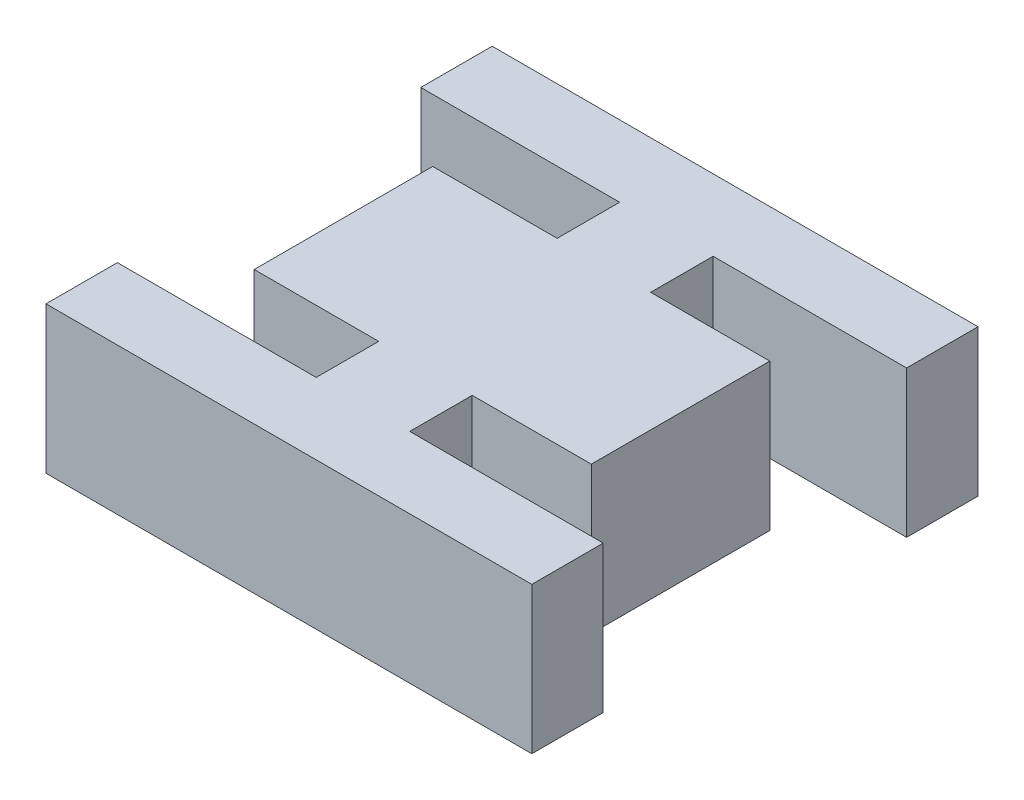
ISO-10303-21;
HEADER;
FILE_DESCRIPTION(('STEP AP214'),'2;1');
FILE_NAME('part.step','',(''),(''),'','','');
FILE_SCHEMA(('AUTOMOTIVE_DESIGN { 1 0 10303 214 1 1 1 1 }'));
ENDSEC;
DATA;
#1=APPLICATION_CONTEXT('core data for automotive mechanical design processes');
#2=APPLICATION_PROTOCOL_DEFINITION('international standard','automotive_design',2000,#1);
#3=PRODUCT_CONTEXT('',#1,'mechanical');
#4=PRODUCT('Part','Part','',(#3));
#5=PRODUCT_RELATED_PRODUCT_CATEGORY('part','',(#4));
#6=PRODUCT_DEFINITION_FORMATION('','',#4);
#7=PRODUCT_DEFINITION_CONTEXT('part definition',#1,'design');
#8=PRODUCT_DEFINITION('design','',#6,#7);
#9=PRODUCT_DEFINITION_SHAPE('','',#8);
#10=(LENGTH_UNIT() NAMED_UNIT(*) SI_UNIT(.MILLI.,.METRE.));
#11=(NAMED_UNIT(*) PLANE_ANGLE_UNIT() SI_UNIT($,.RADIAN.));
#12=(NAMED_UNIT(*) SI_UNIT($,.STERADIAN.) SOLID_ANGLE_UNIT());
#13=UNCERTAINTY_MEASURE_WITH_UNIT(LENGTH_MEASURE(1.E-05),#10,'distance_accuracy_value','');
#14=(GEOMETRIC_REPRESENTATION_CONTEXT(3) GLOBAL_UNCERTAINTY_ASSIGNED_CONTEXT((#13)) GLOBAL_UNIT_ASSIGNED_CONTEXT((#10,
#11,#12)) REPRESENTATION_CONTEXT('',''));
#15=CARTESIAN_POINT('',(0.,0.,0.));
#16=DIRECTION('',(0.,0.,1.));
#17=DIRECTION('',(1.,0.,0.));
#18=AXIS2_PLACEMENT_3D('',#15,#16,#17);
#19=CARTESIAN_POINT('',(122.5,74.,76.5));
#20=DIRECTION('',(-1.,0.,0.));
#21=DIRECTION('',(0.,0.,1.));
#22=AXIS2_PLACEMENT_3D('',#19,#20,#21);
#23=PLANE('',#22);
#24=DIRECTION('',(0.,0.,-1.));
#25=VECTOR('',#24,1.);
#26=CARTESIAN_POINT('',(122.5,0.,76.5));
#27=LINE('',#26,#25);
#28=CARTESIAN_POINT('',(122.5,0.,112.5));
#29=VERTEX_POINT('',#28);
#30=CARTESIAN_POINT('',(122.5,0.,76.5));
#31=VERTEX_POINT('',#30);
#32=EDGE_CURVE('E201',#29,#31,#27,.T.);
#33=ORIENTED_EDGE('',*,*,#32,.T.);
#34=DIRECTION('',(0.,-1.,0.));
#35=VECTOR('',#34,1.);
#36=CARTESIAN_POINT('',(122.5,74.,76.5));
#37=LINE('',#36,#35);
#38=CARTESIAN_POINT('',(122.5,74.,76.5));
#39=VERTEX_POINT('',#38);
#40=EDGE_CURVE('E11',#39,#31,#37,.T.);
#41=ORIENTED_EDGE('',*,*,#40,.F.);
#42=DIRECTION('',(0.,0.,-1.));
#43=VECTOR('',#42,1.);
#44=CARTESIAN_POINT('',(122.5,74.,76.5));
#45=LINE('',#44,#43);
#46=CARTESIAN_POINT('',(122.5,74.,112.5));
#47=VERTEX_POINT('',#46);
#48=EDGE_CURVE('E239',#47,#39,#45,.T.);
#49=ORIENTED_EDGE('',*,*,#48,.F.);
#50=DIRECTION('',(0.,-1.,0.));
#51=VECTOR('',#50,1.);
#52=CARTESIAN_POINT('',(122.5,74.,112.5));
#53=LINE('',#52,#51);
#54=EDGE_CURVE('E197',#47,#29,#53,.T.);
#55=ORIENTED_EDGE('',*,*,#54,.T.);
#56=EDGE_LOOP('',(#33,#41,#49,#55));
#57=FACE_BOUND('',#56,.T.);
#58=ADVANCED_FACE('F33',(#57),#23,.F.);
#59=CARTESIAN_POINT('',(122.5,74.,76.5));
#60=DIRECTION('',(0.,0.,1.));
#61=DIRECTION('',(1.,0.,0.));
#62=AXIS2_PLACEMENT_3D('',#59,#60,#61);
#63=PLANE('',#62);
#64=DIRECTION('',(-1.,0.,0.));
#65=VECTOR('',#64,1.);
#66=CARTESIAN_POINT('',(122.5,0.,76.5));
#67=LINE('',#66,#65);
#68=CARTESIAN_POINT('',(24.9263630000739,0.,76.5000000000001));
#69=VERTEX_POINT('',#68);
#70=EDGE_CURVE('E204',#31,#69,#67,.T.);
#71=ORIENTED_EDGE('',*,*,#70,.T.);
#72=DIRECTION('',(0.,-1.,0.));
#73=VECTOR('',#72,1.);
#74=CARTESIAN_POINT('',(24.9263630000739,74.,76.5000000000001));
#75=LINE('',#74,#73);
#76=CARTESIAN_POINT('',(24.9263630000739,74.,76.5000000000001));
#77=VERTEX_POINT('',#76);
#78=EDGE_CURVE('E41',#77,#69,#75,.T.);
#79=ORIENTED_EDGE('',*,*,#78,.F.);
#80=DIRECTION('',(-1.,0.,0.));
#81=VECTOR('',#80,1.);
#82=CARTESIAN_POINT('',(122.5,74.,76.5));
#83=LINE('',#82,#81);
#84=EDGE_CURVE('E128',#39,#77,#83,.T.);
#85=ORIENTED_EDGE('',*,*,#84,.F.);
#86=ORIENTED_EDGE('',*,*,#40,.T.);
#87=EDGE_LOOP('',(#71,#79,#85,#86));
#88=FACE_BOUND('',#87,.T.);
#89=ADVANCED_FACE('F357',(#88),#63,.F.);
#90=CARTESIAN_POINT('',(24.9263630000739,74.,45.));
#91=DIRECTION('',(-1.,0.,0.));
#92=DIRECTION('',(0.,0.,1.));
#93=AXIS2_PLACEMENT_3D('',#90,#91,#92);
#94=PLANE('',#93);
#95=DIRECTION('',(0.,0.,-1.));
#96=VECTOR('',#95,1.);
#97=CARTESIAN_POINT('',(24.9263630000739,0.,45.));
#98=LINE('',#97,#96);
#99=CARTESIAN_POINT('',(24.9263630000739,0.,45.));
#100=VERTEX_POINT('',#99);
#101=EDGE_CURVE('E206',#69,#100,#98,.T.);
#102=ORIENTED_EDGE('',*,*,#101,.T.);
#103=DIRECTION('',(0.,-1.,0.));
#104=VECTOR('',#103,1.);
#105=CARTESIAN_POINT('',(24.9263630000739,74.,45.));
#106=LINE('',#105,#104);
#107=CARTESIAN_POINT('',(24.9263630000739,74.,45.));
#108=VERTEX_POINT('',#107);
#109=EDGE_CURVE('E282',#108,#100,#106,.T.);
#110=ORIENTED_EDGE('',*,*,#109,.F.);
#111=DIRECTION('',(0.,0.,-1.));
#112=VECTOR('',#111,1.);
#113=CARTESIAN_POINT('',(24.9263630000739,74.,45.));
#114=LINE('',#113,#112);
#115=EDGE_CURVE('E290',#77,#108,#114,.T.);
#116=ORIENTED_EDGE('',*,*,#115,.F.);
#117=ORIENTED_EDGE('',*,*,#78,.T.);
#118=EDGE_LOOP('',(#102,#110,#116,#117));
#119=FACE_BOUND('',#118,.T.);
#120=ADVANCED_FACE('F288',(#119),#94,.F.);
#121=CARTESIAN_POINT('',(24.9263630000739,74.,45.));
#122=DIRECTION('',(0.,0.,-1.));
#123=DIRECTION('',(-1.,0.,0.));
#124=AXIS2_PLACEMENT_3D('',#121,#122,#123);
#125=PLANE('',#124);
#126=DIRECTION('',(1.,0.,0.));
#127=VECTOR('',#126,1.);
#128=CARTESIAN_POINT('',(24.9263630000739,0.,45.));
#129=LINE('',#128,#127);
#130=CARTESIAN_POINT('',(85.,0.,45.));
#131=VERTEX_POINT('',#130);
#132=EDGE_CURVE('E208',#100,#131,#129,.T.);
#133=ORIENTED_EDGE('',*,*,#132,.T.);
#134=DIRECTION('',(0.,-1.,0.));
#135=VECTOR('',#134,1.);
#136=CARTESIAN_POINT('',(85.,74.,45.));
#137=LINE('',#136,#135);
#138=CARTESIAN_POINT('',(85.,74.,45.));
#139=VERTEX_POINT('',#138);
#140=EDGE_CURVE('E279',#139,#131,#137,.T.);
#141=ORIENTED_EDGE('',*,*,#140,.F.);
#142=DIRECTION('',(1.,0.,0.));
#143=VECTOR('',#142,1.);
#144=CARTESIAN_POINT('',(24.9263630000739,74.,45.));
#145=LINE('',#144,#143);
#146=EDGE_CURVE('E308',#108,#139,#145,.T.);
#147=ORIENTED_EDGE('',*,*,#146,.F.);
#148=ORIENTED_EDGE('',*,*,#109,.T.);
#149=EDGE_LOOP('',(#133,#141,#147,#148));
#150=FACE_BOUND('',#149,.T.);
#151=ADVANCED_FACE('F299',(#150),#125,.F.);
#152=CARTESIAN_POINT('',(85.,74.,-45.));
#153=DIRECTION('',(-1.,0.,0.));
#154=DIRECTION('',(0.,0.,1.));
#155=AXIS2_PLACEMENT_3D('',#152,#153,#154);
#156=PLANE('',#155);
#157=DIRECTION('',(0.,0.,-1.));
#158=VECTOR('',#157,1.);
#159=CARTESIAN_POINT('',(85.,0.,-45.));
#160=LINE('',#159,#158);
#161=CARTESIAN_POINT('',(85.,0.,-45.));
#162=VERTEX_POINT('',#161);
#163=EDGE_CURVE('E210',#131,#162,#160,.T.);
#164=ORIENTED_EDGE('',*,*,#163,.T.);
#165=DIRECTION('',(0.,-1.,0.));
#166=VECTOR('',#165,1.);
#167=CARTESIAN_POINT('',(85.,74.,-45.));
#168=LINE('',#167,#166);
#169=CARTESIAN_POINT('',(85.,74.,-45.));
#170=VERTEX_POINT('',#169);
#171=EDGE_CURVE('E276',#170,#162,#168,.T.);
#172=ORIENTED_EDGE('',*,*,#171,.F.);
#173=DIRECTION('',(0.,0.,-1.));
#174=VECTOR('',#173,1.);
#175=CARTESIAN_POINT('',(85.,74.,-45.));
#176=LINE('',#175,#174);
#177=EDGE_CURVE('E305',#139,#170,#176,.T.);
#178=ORIENTED_EDGE('',*,*,#177,.F.);
#179=ORIENTED_EDGE('',*,*,#140,.T.);
#180=EDGE_LOOP('',(#164,#172,#178,#179));
#181=FACE_BOUND('',#180,.T.);
#182=ADVANCED_FACE('F303',(#181),#156,.F.);
#183=CARTESIAN_POINT('',(24.9263630000739,74.,-45.));
#184=DIRECTION('',(0.,0.,1.));
#185=DIRECTION('',(1.,0.,0.));
#186=AXIS2_PLACEMENT_3D('',#183,#184,#185);
#187=PLANE('',#186);
#188=DIRECTION('',(-1.,0.,0.));
#189=VECTOR('',#188,1.);
#190=CARTESIAN_POINT('',(24.9263630000739,0.,-45.));
#191=LINE('',#190,#189);
#192=CARTESIAN_POINT('',(24.9263630000739,0.,-45.));
#193=VERTEX_POINT('',#192);
#194=EDGE_CURVE('E212',#162,#193,#191,.T.);
#195=ORIENTED_EDGE('',*,*,#194,.T.);
#196=DIRECTION('',(0.,-1.,0.));
#197=VECTOR('',#196,1.);
#198=CARTESIAN_POINT('',(24.9263630000739,74.,-45.));
#199=LINE('',#198,#197);
#200=CARTESIAN_POINT('',(24.9263630000739,74.,-45.));
#201=VERTEX_POINT('',#200);
#202=EDGE_CURVE('E273',#201,#193,#199,.T.);
#203=ORIENTED_EDGE('',*,*,#202,.F.);
#204=DIRECTION('',(-1.,0.,0.));
#205=VECTOR('',#204,1.);
#206=CARTESIAN_POINT('',(24.9263630000739,74.,-45.));
#207=LINE('',#206,#205);
#208=EDGE_CURVE('E307',#170,#201,#207,.T.);
#209=ORIENTED_EDGE('',*,*,#208,.F.);
#210=ORIENTED_EDGE('',*,*,#171,.T.);
#211=EDGE_LOOP('',(#195,#203,#209,#210));
#212=FACE_BOUND('',#211,.T.);
#213=ADVANCED_FACE('F370',(#212),#187,.F.);
#214=CARTESIAN_POINT('',(24.9263630000739,74.,-76.5));
#215=DIRECTION('',(-1.,0.,0.));
#216=DIRECTION('',(0.,0.,1.));
#217=AXIS2_PLACEMENT_3D('',#214,#215,#216);
#218=PLANE('',#217);
#219=DIRECTION('',(0.,0.,-1.));
#220=VECTOR('',#219,1.);
#221=CARTESIAN_POINT('',(24.9263630000739,0.,-76.5));
#222=LINE('',#221,#220);
#223=CARTESIAN_POINT('',(24.9263630000739,0.,-76.5));
#224=VERTEX_POINT('',#223);
#225=EDGE_CURVE('E214',#193,#224,#222,.T.);
#226=ORIENTED_EDGE('',*,*,#225,.T.);
#227=DIRECTION('',(0.,-1.,0.));
#228=VECTOR('',#227,1.);
#229=CARTESIAN_POINT('',(24.9263630000739,74.,-76.5));
#230=LINE('',#229,#228);
#231=CARTESIAN_POINT('',(24.9263630000739,74.,-76.5));
#232=VERTEX_POINT('',#231);
#233=EDGE_CURVE('E270',#232,#224,#230,.T.);
#234=ORIENTED_EDGE('',*,*,#233,.F.);
#235=DIRECTION('',(0.,0.,-1.));
#236=VECTOR('',#235,1.);
#237=CARTESIAN_POINT('',(24.9263630000739,74.,-76.5));
#238=LINE('',#237,#236);
#239=EDGE_CURVE('E310',#201,#232,#238,.T.);
#240=ORIENTED_EDGE('',*,*,#239,.F.);
#241=ORIENTED_EDGE('',*,*,#202,.T.);
#242=EDGE_LOOP('',(#226,#234,#240,#241));
#243=FACE_BOUND('',#242,.T.);
#244=ADVANCED_FACE('F373',(#243),#218,.F.);
#245=CARTESIAN_POINT('',(24.9263630000739,74.,-76.5));
#246=DIRECTION('',(0.,0.,-1.));
#247=DIRECTION('',(-1.,0.,0.));
#248=AXIS2_PLACEMENT_3D('',#245,#246,#247);
#249=PLANE('',#248);
#250=DIRECTION('',(1.,0.,0.));
#251=VECTOR('',#250,1.);
#252=CARTESIAN_POINT('',(24.9263630000739,0.,-76.5));
#253=LINE('',#252,#251);
#254=CARTESIAN_POINT('',(122.5,0.,-76.5));
#255=VERTEX_POINT('',#254);
#256=EDGE_CURVE('E216',#224,#255,#253,.T.);
#257=ORIENTED_EDGE('',*,*,#256,.T.);
#258=DIRECTION('',(0.,-1.,0.));
#259=VECTOR('',#258,1.);
#260=CARTESIAN_POINT('',(122.5,74.,-76.5));
#261=LINE('',#260,#259);
#262=CARTESIAN_POINT('',(122.5,74.,-76.5));
#263=VERTEX_POINT('',#262);
#264=EDGE_CURVE('E267',#263,#255,#261,.T.);
#265=ORIENTED_EDGE('',*,*,#264,.F.);
#266=DIRECTION('',(1.,0.,0.));
#267=VECTOR('',#266,1.);
#268=CARTESIAN_POINT('',(24.9263630000739,74.,-76.5));
#269=LINE('',#268,#267);
#270=EDGE_CURVE('E316',#232,#263,#269,.T.);
#271=ORIENTED_EDGE('',*,*,#270,.F.);
#272=ORIENTED_EDGE('',*,*,#233,.T.);
#273=EDGE_LOOP('',(#257,#265,#271,#272));
#274=FACE_BOUND('',#273,.T.);
#275=ADVANCED_FACE('F377',(#274),#249,.F.);
#276=CARTESIAN_POINT('',(122.5,74.,-112.5));
#277=DIRECTION('',(-1.,0.,0.));
#278=DIRECTION('',(0.,0.,1.));
#279=AXIS2_PLACEMENT_3D('',#276,#277,#278);
#280=PLANE('',#279);
#281=DIRECTION('',(0.,0.,-1.));
#282=VECTOR('',#281,1.);
#283=CARTESIAN_POINT('',(122.5,0.,-112.5));
#284=LINE('',#283,#282);
#285=CARTESIAN_POINT('',(122.5,0.,-112.5));
#286=VERTEX_POINT('',#285);
#287=EDGE_CURVE('E218',#255,#286,#284,.T.);
#288=ORIENTED_EDGE('',*,*,#287,.T.);
#289=DIRECTION('',(0.,-1.,0.));
#290=VECTOR('',#289,1.);
#291=CARTESIAN_POINT('',(122.5,74.,-112.5));
#292=LINE('',#291,#290);
#293=CARTESIAN_POINT('',(122.5,74.,-112.5));
#294=VERTEX_POINT('',#293);
#295=EDGE_CURVE('E264',#294,#286,#292,.T.);
#296=ORIENTED_EDGE('',*,*,#295,.F.);
#297=DIRECTION('',(0.,0.,-1.));
#298=VECTOR('',#297,1.);
#299=CARTESIAN_POINT('',(122.5,74.,-112.5));
#300=LINE('',#299,#298);
#301=EDGE_CURVE('E318',#263,#294,#300,.T.);
#302=ORIENTED_EDGE('',*,*,#301,.F.);
#303=ORIENTED_EDGE('',*,*,#264,.T.);
#304=EDGE_LOOP('',(#288,#296,#302,#303));
#305=FACE_BOUND('',#304,.T.);
#306=ADVANCED_FACE('F381',(#305),#280,.F.);
#307=CARTESIAN_POINT('',(-122.5,74.,-112.5));
#308=DIRECTION('',(0.,0.,1.));
#309=DIRECTION('',(1.,0.,0.));
#310=AXIS2_PLACEMENT_3D('',#307,#308,#309);
#311=PLANE('',#310);
#312=DIRECTION('',(-1.,0.,0.));
#313=VECTOR('',#312,1.);
#314=CARTESIAN_POINT('',(-122.5,0.,-112.5));
#315=LINE('',#314,#313);
#316=CARTESIAN_POINT('',(-122.5,0.,-112.5));
#317=VERTEX_POINT('',#316);
#318=EDGE_CURVE('E220',#286,#317,#315,.T.);
#319=ORIENTED_EDGE('',*,*,#318,.T.);
#320=DIRECTION('',(0.,-1.,0.));
#321=VECTOR('',#320,1.);
#322=CARTESIAN_POINT('',(-122.5,74.,-112.5));
#323=LINE('',#322,#321);
#324=CARTESIAN_POINT('',(-122.5,74.,-112.5));
#325=VERTEX_POINT('',#324);
#326=EDGE_CURVE('E261',#325,#317,#323,.T.);
#327=ORIENTED_EDGE('',*,*,#326,.F.);
#328=DIRECTION('',(-1.,0.,0.));
#329=VECTOR('',#328,1.);
#330=CARTESIAN_POINT('',(-122.5,74.,-112.5));
#331=LINE('',#330,#329);
#332=EDGE_CURVE('E320',#294,#325,#331,.T.);
#333=ORIENTED_EDGE('',*,*,#332,.F.);
#334=ORIENTED_EDGE('',*,*,#295,.T.);
#335=EDGE_LOOP('',(#319,#327,#333,#334));
#336=FACE_BOUND('',#335,.T.);
#337=ADVANCED_FACE('F385',(#336),#311,.F.);
#338=CARTESIAN_POINT('',(-122.5,74.,-112.5));
#339=DIRECTION('',(1.,0.,0.));
#340=DIRECTION('',(0.,0.,-1.));
#341=AXIS2_PLACEMENT_3D('',#338,#339,#340);
#342=PLANE('',#341);
#343=DIRECTION('',(0.,0.,1.));
#344=VECTOR('',#343,1.);
#345=CARTESIAN_POINT('',(-122.5,0.,-112.5));
#346=LINE('',#345,#344);
#347=CARTESIAN_POINT('',(-122.5,0.,-76.5));
#348=VERTEX_POINT('',#347);
#349=EDGE_CURVE('E222',#317,#348,#346,.T.);
#350=ORIENTED_EDGE('',*,*,#349,.T.);
#351=DIRECTION('',(0.,-1.,0.));
#352=VECTOR('',#351,1.);
#353=CARTESIAN_POINT('',(-122.5,74.,-76.5));
#354=LINE('',#353,#352);
#355=CARTESIAN_POINT('',(-122.5,74.,-76.5));
#356=VERTEX_POINT('',#355);
#357=EDGE_CURVE('E258',#356,#348,#354,.T.);
#358=ORIENTED_EDGE('',*,*,#357,.F.);
#359=DIRECTION('',(0.,0.,1.));
#360=VECTOR('',#359,1.);
#361=CARTESIAN_POINT('',(-122.5,74.,-112.5));
#362=LINE('',#361,#360);
#363=EDGE_CURVE('E322',#325,#356,#362,.T.);
#364=ORIENTED_EDGE('',*,*,#363,.F.);
#365=ORIENTED_EDGE('',*,*,#326,.T.);
#366=EDGE_LOOP('',(#350,#358,#364,#365));
#367=FACE_BOUND('',#366,.T.);
#368=ADVANCED_FACE('F389',(#367),#342,.F.);
#369=CARTESIAN_POINT('',(-122.5,74.,-76.5));
#370=DIRECTION('',(0.,0.,-1.));
#371=DIRECTION('',(-1.,0.,0.));
#372=AXIS2_PLACEMENT_3D('',#369,#370,#371);
#373=PLANE('',#372);
#374=DIRECTION('',(1.,0.,0.));
#375=VECTOR('',#374,1.);
#376=CARTESIAN_POINT('',(-122.5,0.,-76.5));
#377=LINE('',#376,#375);
#378=CARTESIAN_POINT('',(-22.226343261514,0.,-76.5));
#379=VERTEX_POINT('',#378);
#380=EDGE_CURVE('E224',#348,#379,#377,.T.);
#381=ORIENTED_EDGE('',*,*,#380,.T.);
#382=DIRECTION('',(0.,-1.,0.));
#383=VECTOR('',#382,1.);
#384=CARTESIAN_POINT('',(-22.226343261514,74.,-76.5));
#385=LINE('',#384,#383);
#386=CARTESIAN_POINT('',(-22.226343261514,74.,-76.5));
#387=VERTEX_POINT('',#386);
#388=EDGE_CURVE('E255',#387,#379,#385,.T.);
#389=ORIENTED_EDGE('',*,*,#388,.F.);
#390=DIRECTION('',(1.,0.,0.));
#391=VECTOR('',#390,1.);
#392=CARTESIAN_POINT('',(-122.5,74.,-76.5));
#393=LINE('',#392,#391);
#394=EDGE_CURVE('E324',#356,#387,#393,.T.);
#395=ORIENTED_EDGE('',*,*,#394,.F.);
#396=ORIENTED_EDGE('',*,*,#357,.T.);
#397=EDGE_LOOP('',(#381,#389,#395,#396));
#398=FACE_BOUND('',#397,.T.);
#399=ADVANCED_FACE('F393',(#398),#373,.F.);
#400=CARTESIAN_POINT('',(-22.226343261514,74.,-76.5));
#401=DIRECTION('',(1.,0.,0.));
#402=DIRECTION('',(0.,0.,-1.));
#403=AXIS2_PLACEMENT_3D('',#400,#401,#402);
#404=PLANE('',#403);
#405=DIRECTION('',(0.,0.,1.));
#406=VECTOR('',#405,1.);
#407=CARTESIAN_POINT('',(-22.226343261514,0.,-76.5));
#408=LINE('',#407,#406);
#409=CARTESIAN_POINT('',(-22.226343261514,0.,-45.));
#410=VERTEX_POINT('',#409);
#411=EDGE_CURVE('E226',#379,#410,#408,.T.);
#412=ORIENTED_EDGE('',*,*,#411,.T.);
#413=DIRECTION('',(0.,-1.,0.));
#414=VECTOR('',#413,1.);
#415=CARTESIAN_POINT('',(-22.226343261514,74.,-45.));
#416=LINE('',#415,#414);
#417=CARTESIAN_POINT('',(-22.226343261514,74.,-45.));
#418=VERTEX_POINT('',#417);
#419=EDGE_CURVE('E252',#418,#410,#416,.T.);
#420=ORIENTED_EDGE('',*,*,#419,.F.);
#421=DIRECTION('',(0.,0.,1.));
#422=VECTOR('',#421,1.);
#423=CARTESIAN_POINT('',(-22.226343261514,74.,-76.5));
#424=LINE('',#423,#422);
#425=EDGE_CURVE('E326',#387,#418,#424,.T.);
#426=ORIENTED_EDGE('',*,*,#425,.F.);
#427=ORIENTED_EDGE('',*,*,#388,.T.);
#428=EDGE_LOOP('',(#412,#420,#426,#427));
#429=FACE_BOUND('',#428,.T.);
#430=ADVANCED_FACE('F397',(#429),#404,.F.);
#431=CARTESIAN_POINT('',(-85.,74.,-45.));
#432=DIRECTION('',(0.,0.,1.));
#433=DIRECTION('',(1.,0.,0.));
#434=AXIS2_PLACEMENT_3D('',#431,#432,#433);
#435=PLANE('',#434);
#436=DIRECTION('',(-1.,0.,0.));
#437=VECTOR('',#436,1.);
#438=CARTESIAN_POINT('',(-85.,0.,-45.));
#439=LINE('',#438,#437);
#440=CARTESIAN_POINT('',(-85.,0.,-45.));
#441=VERTEX_POINT('',#440);
#442=EDGE_CURVE('E228',#410,#441,#439,.T.);
#443=ORIENTED_EDGE('',*,*,#442,.T.);
#444=DIRECTION('',(0.,-1.,0.));
#445=VECTOR('',#444,1.);
#446=CARTESIAN_POINT('',(-85.,74.,-45.));
#447=LINE('',#446,#445);
#448=CARTESIAN_POINT('',(-85.,74.,-45.));
#449=VERTEX_POINT('',#448);
#450=EDGE_CURVE('E249',#449,#441,#447,.T.);
#451=ORIENTED_EDGE('',*,*,#450,.F.);
#452=DIRECTION('',(-1.,0.,0.));
#453=VECTOR('',#452,1.);
#454=CARTESIAN_POINT('',(-85.,74.,-45.));
#455=LINE('',#454,#453);
#456=EDGE_CURVE('E328',#418,#449,#455,.T.);
#457=ORIENTED_EDGE('',*,*,#456,.F.);
#458=ORIENTED_EDGE('',*,*,#419,.T.);
#459=EDGE_LOOP('',(#443,#451,#457,#458));
#460=FACE_BOUND('',#459,.T.);
#461=ADVANCED_FACE('F401',(#460),#435,.F.);
#462=CARTESIAN_POINT('',(-85.,74.,-45.));
#463=DIRECTION('',(1.,0.,0.));
#464=DIRECTION('',(0.,0.,-1.));
#465=AXIS2_PLACEMENT_3D('',#462,#463,#464);
#466=PLANE('',#465);
#467=DIRECTION('',(0.,0.,1.));
#468=VECTOR('',#467,1.);
#469=CARTESIAN_POINT('',(-85.,0.,-45.));
#470=LINE('',#469,#468);
#471=CARTESIAN_POINT('',(-85.,0.,45.));
#472=VERTEX_POINT('',#471);
#473=EDGE_CURVE('E230',#441,#472,#470,.T.);
#474=ORIENTED_EDGE('',*,*,#473,.T.);
#475=DIRECTION('',(0.,-1.,0.));
#476=VECTOR('',#475,1.);
#477=CARTESIAN_POINT('',(-85.,74.,45.));
#478=LINE('',#477,#476);
#479=CARTESIAN_POINT('',(-85.,74.,45.));
#480=VERTEX_POINT('',#479);
#481=EDGE_CURVE('E246',#480,#472,#478,.T.);
#482=ORIENTED_EDGE('',*,*,#481,.F.);
#483=DIRECTION('',(0.,0.,1.));
#484=VECTOR('',#483,1.);
#485=CARTESIAN_POINT('',(-85.,74.,-45.));
#486=LINE('',#485,#484);
#487=EDGE_CURVE('E330',#449,#480,#486,.T.);
#488=ORIENTED_EDGE('',*,*,#487,.F.);
#489=ORIENTED_EDGE('',*,*,#450,.T.);
#490=EDGE_LOOP('',(#474,#482,#488,#489));
#491=FACE_BOUND('',#490,.T.);
#492=ADVANCED_FACE('F405',(#491),#466,.F.);
#493=CARTESIAN_POINT('',(-85.,74.,45.));
#494=DIRECTION('',(0.,0.,-1.));
#495=DIRECTION('',(-1.,0.,0.));
#496=AXIS2_PLACEMENT_3D('',#493,#494,#495);
#497=PLANE('',#496);
#498=DIRECTION('',(1.,0.,0.));
#499=VECTOR('',#498,1.);
#500=CARTESIAN_POINT('',(-85.,0.,45.));
#501=LINE('',#500,#499);
#502=CARTESIAN_POINT('',(-22.226343261514,0.,45.));
#503=VERTEX_POINT('',#502);
#504=EDGE_CURVE('E232',#472,#503,#501,.T.);
#505=ORIENTED_EDGE('',*,*,#504,.T.);
#506=DIRECTION('',(0.,-1.,0.));
#507=VECTOR('',#506,1.);
#508=CARTESIAN_POINT('',(-22.226343261514,74.,45.));
#509=LINE('',#508,#507);
#510=CARTESIAN_POINT('',(-22.226343261514,74.,45.));
#511=VERTEX_POINT('',#510);
#512=EDGE_CURVE('E243',#511,#503,#509,.T.);
#513=ORIENTED_EDGE('',*,*,#512,.F.);
#514=DIRECTION('',(1.,0.,0.));
#515=VECTOR('',#514,1.);
#516=CARTESIAN_POINT('',(-85.,74.,45.));
#517=LINE('',#516,#515);
#518=EDGE_CURVE('E332',#480,#511,#517,.T.);
#519=ORIENTED_EDGE('',*,*,#518,.F.);
#520=ORIENTED_EDGE('',*,*,#481,.T.);
#521=EDGE_LOOP('',(#505,#513,#519,#520));
#522=FACE_BOUND('',#521,.T.);
#523=ADVANCED_FACE('F338',(#522),#497,.F.);
#524=CARTESIAN_POINT('',(-22.226343261514,74.,45.));
#525=DIRECTION('',(1.,0.,0.));
#526=DIRECTION('',(0.,0.,-1.));
#527=AXIS2_PLACEMENT_3D('',#524,#525,#526);
#528=PLANE('',#527);
#529=DIRECTION('',(0.,0.,1.));
#530=VECTOR('',#529,1.);
#531=CARTESIAN_POINT('',(-22.226343261514,0.,45.));
#532=LINE('',#531,#530);
#533=CARTESIAN_POINT('',(-22.226343261514,0.,76.5000000000001));
#534=VERTEX_POINT('',#533);
#535=EDGE_CURVE('E234',#503,#534,#532,.T.);
#536=ORIENTED_EDGE('',*,*,#535,.T.);
#537=DIRECTION('',(0.,-1.,0.));
#538=VECTOR('',#537,1.);
#539=CARTESIAN_POINT('',(-22.226343261514,74.,76.5000000000001));
#540=LINE('',#539,#538);
#541=CARTESIAN_POINT('',(-22.226343261514,74.,76.5000000000001));
#542=VERTEX_POINT('',#541);
#543=EDGE_CURVE('E192',#542,#534,#540,.T.);
#544=ORIENTED_EDGE('',*,*,#543,.F.);
#545=DIRECTION('',(0.,0.,1.));
#546=VECTOR('',#545,1.);
#547=CARTESIAN_POINT('',(-22.226343261514,74.,45.));
#548=LINE('',#547,#546);
#549=EDGE_CURVE('E183',#511,#542,#548,.T.);
#550=ORIENTED_EDGE('',*,*,#549,.F.);
#551=ORIENTED_EDGE('',*,*,#512,.T.);
#552=EDGE_LOOP('',(#536,#544,#550,#551));
#553=FACE_BOUND('',#552,.T.);
#554=ADVANCED_FACE('F342',(#553),#528,.F.);
#555=CARTESIAN_POINT('',(-22.226343261514,74.,76.5000000000001));
#556=DIRECTION('',(0.,0.,1.));
#557=DIRECTION('',(1.,0.,0.));
#558=AXIS2_PLACEMENT_3D('',#555,#556,#557);
#559=PLANE('',#558);
#560=DIRECTION('',(-1.,0.,0.));
#561=VECTOR('',#560,1.);
#562=CARTESIAN_POINT('',(-22.226343261514,0.,76.5000000000001));
#563=LINE('',#562,#561);
#564=CARTESIAN_POINT('',(-122.5,0.,76.5000000000001));
#565=VERTEX_POINT('',#564);
#566=EDGE_CURVE('E191',#534,#565,#563,.T.);
#567=ORIENTED_EDGE('',*,*,#566,.T.);
#568=DIRECTION('',(0.,-1.,0.));
#569=VECTOR('',#568,1.);
#570=CARTESIAN_POINT('',(-122.5,74.,76.5000000000001));
#571=LINE('',#570,#569);
#572=CARTESIAN_POINT('',(-122.5,74.,76.5000000000001));
#573=VERTEX_POINT('',#572);
#574=EDGE_CURVE('E188',#573,#565,#571,.T.);
#575=ORIENTED_EDGE('',*,*,#574,.F.);
#576=DIRECTION('',(-1.,0.,0.));
#577=VECTOR('',#576,1.);
#578=CARTESIAN_POINT('',(-22.226343261514,74.,76.5000000000001));
#579=LINE('',#578,#577);
#580=EDGE_CURVE('E177',#542,#573,#579,.T.);
#581=ORIENTED_EDGE('',*,*,#580,.F.);
#582=ORIENTED_EDGE('',*,*,#543,.T.);
#583=EDGE_LOOP('',(#567,#575,#581,#582));
#584=FACE_BOUND('',#583,.T.);
#585=ADVANCED_FACE('F189',(#584),#559,.F.);
#586=CARTESIAN_POINT('',(-122.5,74.,76.5000000000001));
#587=DIRECTION('',(1.,0.,0.));
#588=DIRECTION('',(0.,0.,-1.));
#589=AXIS2_PLACEMENT_3D('',#586,#587,#588);
#590=PLANE('',#589);
#591=DIRECTION('',(0.,0.,1.));
#592=VECTOR('',#591,1.);
#593=CARTESIAN_POINT('',(-122.5,0.,76.5000000000001));
#594=LINE('',#593,#592);
#595=CARTESIAN_POINT('',(-122.5,0.,112.5));
#596=VERTEX_POINT('',#595);
#597=EDGE_CURVE('E114',#565,#596,#594,.T.);
#598=ORIENTED_EDGE('',*,*,#597,.T.);
#599=DIRECTION('',(0.,-1.,0.));
#600=VECTOR('',#599,1.);
#601=CARTESIAN_POINT('',(-122.5,74.,112.5));
#602=LINE('',#601,#600);
#603=CARTESIAN_POINT('',(-122.5,74.,112.5));
#604=VERTEX_POINT('',#603);
#605=EDGE_CURVE('E193',#604,#596,#602,.T.);
#606=ORIENTED_EDGE('',*,*,#605,.F.);
#607=DIRECTION('',(0.,0.,1.));
#608=VECTOR('',#607,1.);
#609=CARTESIAN_POINT('',(-122.5,74.,76.5000000000001));
#610=LINE('',#609,#608);
#611=EDGE_CURVE('E181',#573,#604,#610,.T.);
#612=ORIENTED_EDGE('',*,*,#611,.F.);
#613=ORIENTED_EDGE('',*,*,#574,.T.);
#614=EDGE_LOOP('',(#598,#606,#612,#613));
#615=FACE_BOUND('',#614,.T.);
#616=ADVANCED_FACE('F195',(#615),#590,.F.);
#617=CARTESIAN_POINT('',(-122.5,74.,112.5));
#618=DIRECTION('',(0.,0.,-1.));
#619=DIRECTION('',(-1.,0.,0.));
#620=AXIS2_PLACEMENT_3D('',#617,#618,#619);
#621=PLANE('',#620);
#622=DIRECTION('',(1.,0.,0.));
#623=VECTOR('',#622,1.);
#624=CARTESIAN_POINT('',(-122.5,0.,112.5));
#625=LINE('',#624,#623);
#626=EDGE_CURVE('E120',#596,#29,#625,.T.);
#627=ORIENTED_EDGE('',*,*,#626,.T.);
#628=ORIENTED_EDGE('',*,*,#54,.F.);
#629=DIRECTION('',(1.,0.,0.));
#630=VECTOR('',#629,1.);
#631=CARTESIAN_POINT('',(-122.5,74.,112.5));
#632=LINE('',#631,#630);
#633=EDGE_CURVE('E49',#604,#47,#632,.T.);
#634=ORIENTED_EDGE('',*,*,#633,.F.);
#635=ORIENTED_EDGE('',*,*,#605,.T.);
#636=EDGE_LOOP('',(#627,#628,#634,#635));
#637=FACE_BOUND('',#636,.T.);
#638=ADVANCED_FACE('F346',(#637),#621,.F.);
#639=CARTESIAN_POINT('',(0.,74.,0.));
#640=DIRECTION('',(0.,1.,0.));
#641=DIRECTION('',(0.,0.,1.));
#642=AXIS2_PLACEMENT_3D('',#639,#640,#641);
#643=PLANE('',#642);
#644=ORIENTED_EDGE('',*,*,#48,.T.);
#645=ORIENTED_EDGE('',*,*,#84,.T.);
#646=ORIENTED_EDGE('',*,*,#115,.T.);
#647=ORIENTED_EDGE('',*,*,#146,.T.);
#648=ORIENTED_EDGE('',*,*,#177,.T.);
#649=ORIENTED_EDGE('',*,*,#208,.T.);
#650=ORIENTED_EDGE('',*,*,#239,.T.);
#651=ORIENTED_EDGE('',*,*,#270,.T.);
#652=ORIENTED_EDGE('',*,*,#301,.T.);
#653=ORIENTED_EDGE('',*,*,#332,.T.);
#654=ORIENTED_EDGE('',*,*,#363,.T.);
#655=ORIENTED_EDGE('',*,*,#394,.T.);
#656=ORIENTED_EDGE('',*,*,#425,.T.);
#657=ORIENTED_EDGE('',*,*,#456,.T.);
#658=ORIENTED_EDGE('',*,*,#487,.T.);
#659=ORIENTED_EDGE('',*,*,#518,.T.);
#660=ORIENTED_EDGE('',*,*,#549,.T.);
#661=ORIENTED_EDGE('',*,*,#580,.T.);
#662=ORIENTED_EDGE('',*,*,#611,.T.);
#663=ORIENTED_EDGE('',*,*,#633,.T.);
#664=EDGE_LOOP('',(#644,#645,#646,#647,#648,#649,#650,#651,#652,#653,#654,#655,#656,#657,#658,
#659,#660,#661,#662,#663));
#665=FACE_BOUND('',#664,.T.);
#666=ADVANCED_FACE('F179',(#665),#643,.T.);
#667=CARTESIAN_POINT('',(0.,0.,0.));
#668=DIRECTION('',(0.,1.,0.));
#669=DIRECTION('',(0.,0.,1.));
#670=AXIS2_PLACEMENT_3D('',#667,#668,#669);
#671=PLANE('',#670);
#672=ORIENTED_EDGE('',*,*,#32,.F.);
#673=ORIENTED_EDGE('',*,*,#626,.F.);
#674=ORIENTED_EDGE('',*,*,#597,.F.);
#675=ORIENTED_EDGE('',*,*,#566,.F.);
#676=ORIENTED_EDGE('',*,*,#535,.F.);
#677=ORIENTED_EDGE('',*,*,#504,.F.);
#678=ORIENTED_EDGE('',*,*,#473,.F.);
#679=ORIENTED_EDGE('',*,*,#442,.F.);
#680=ORIENTED_EDGE('',*,*,#411,.F.);
#681=ORIENTED_EDGE('',*,*,#380,.F.);
#682=ORIENTED_EDGE('',*,*,#349,.F.);
#683=ORIENTED_EDGE('',*,*,#318,.F.);
#684=ORIENTED_EDGE('',*,*,#287,.F.);
#685=ORIENTED_EDGE('',*,*,#256,.F.);
#686=ORIENTED_EDGE('',*,*,#225,.F.);
#687=ORIENTED_EDGE('',*,*,#194,.F.);
#688=ORIENTED_EDGE('',*,*,#163,.F.);
#689=ORIENTED_EDGE('',*,*,#132,.F.);
#690=ORIENTED_EDGE('',*,*,#101,.F.);
#691=ORIENTED_EDGE('',*,*,#70,.F.);
#692=EDGE_LOOP('',(#672,#673,#674,#675,#676,#677,#678,#679,#680,#681,#682,#683,#684,#685,#686,
#687,#688,#689,#690,#691));
#693=FACE_BOUND('',#692,.T.);
#694=ADVANCED_FACE('F294',(#693),#671,.F.);
#695=CLOSED_SHELL('',(#58,#89,#120,#151,#182,#213,#244,#275,#306,#337,#368,#399,#430,#461,#492,
#523,#554,#585,#616,#638,#666,#694));
#696=MANIFOLD_SOLID_BREP('B2',#695);
#697=ADVANCED_BREP_SHAPE_REPRESENTATION('',(#18,#696),#14);
#698=SHAPE_DEFINITION_REPRESENTATION(#9,#697);
ENDSEC;
END-ISO-10303-21;
